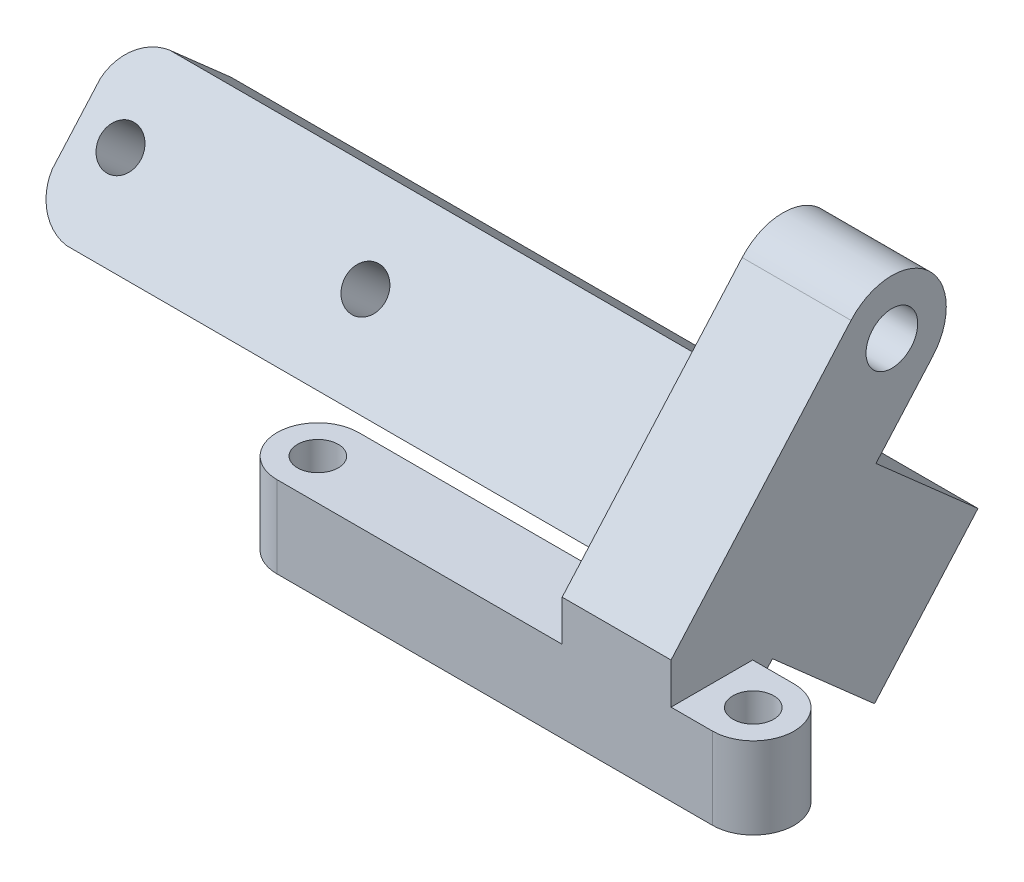
ISO-10303-21;
HEADER;
FILE_DESCRIPTION(('STEP AP214'),'2;1');
FILE_NAME('part.step','',(''),(''),'','','');
FILE_SCHEMA(('AUTOMOTIVE_DESIGN { 1 0 10303 214 1 1 1 1 }'));
ENDSEC;
DATA;
#1=APPLICATION_CONTEXT('core data for automotive mechanical design processes');
#2=APPLICATION_PROTOCOL_DEFINITION('international standard','automotive_design',2000,#1);
#3=PRODUCT_CONTEXT('',#1,'mechanical');
#4=PRODUCT('Part','Part','',(#3));
#5=PRODUCT_RELATED_PRODUCT_CATEGORY('part','',(#4));
#6=PRODUCT_DEFINITION_FORMATION('','',#4);
#7=PRODUCT_DEFINITION_CONTEXT('part definition',#1,'design');
#8=PRODUCT_DEFINITION('design','',#6,#7);
#9=PRODUCT_DEFINITION_SHAPE('','',#8);
#10=(LENGTH_UNIT() NAMED_UNIT(*) SI_UNIT(.MILLI.,.METRE.));
#11=(NAMED_UNIT(*) PLANE_ANGLE_UNIT() SI_UNIT($,.RADIAN.));
#12=(NAMED_UNIT(*) SI_UNIT($,.STERADIAN.) SOLID_ANGLE_UNIT());
#13=UNCERTAINTY_MEASURE_WITH_UNIT(LENGTH_MEASURE(1.E-05),#10,'distance_accuracy_value','');
#14=(GEOMETRIC_REPRESENTATION_CONTEXT(3) GLOBAL_UNCERTAINTY_ASSIGNED_CONTEXT((#13)) GLOBAL_UNIT_ASSIGNED_CONTEXT((#10,
#11,#12)) REPRESENTATION_CONTEXT('',''));
#15=CARTESIAN_POINT('',(0.,0.,0.));
#16=DIRECTION('',(0.,0.,1.));
#17=DIRECTION('',(1.,0.,0.));
#18=AXIS2_PLACEMENT_3D('',#15,#16,#17);
#19=CARTESIAN_POINT('',(-9.72275825615475,1.36573868678583,-19.5587169959805));
#20=DIRECTION('',(0.,-0.749999999999999,0.661437827766149));
#21=DIRECTION('',(0.,-0.661437827766149,-0.749999999999999));
#22=AXIS2_PLACEMENT_3D('',#19,#20,#21);
#23=PLANE('',#22);
#24=DIRECTION('',(0.,-0.661437827766149,-0.749999999999999));
#25=VECTOR('',#24,1.);
#26=CARTESIAN_POINT('',(-64.6035882970213,7.98011696444732,-12.0587169959806));
#27=LINE('',#26,#25);
#28=CARTESIAN_POINT('',(-64.6035882970213,5.33436565338272,-15.0587169959806));
#29=VERTEX_POINT('',#28);
#30=CARTESIAN_POINT('',(-64.6035882970213,1.36573868678583,-19.5587169959805));
#31=VERTEX_POINT('',#30);
#32=EDGE_CURVE('E185',#29,#31,#27,.T.);
#33=ORIENTED_EDGE('',*,*,#32,.F.);
#34=DIRECTION('',(1.,0.,0.));
#35=VECTOR('',#34,1.);
#36=CARTESIAN_POINT('',(-67.683307842008,5.33436565338272,-15.0587169959806));
#37=LINE('',#36,#35);
#38=CARTESIAN_POINT('',(-17.683307842008,5.33436565338272,-15.0587169959806));
#39=VERTEX_POINT('',#38);
#40=EDGE_CURVE('E299',#29,#39,#37,.T.);
#41=ORIENTED_EDGE('',*,*,#40,.T.);
#42=DIRECTION('',(0.,0.661437827766149,0.749999999999999));
#43=VECTOR('',#42,1.);
#44=CARTESIAN_POINT('',(-17.683307842008,1.36573868678583,-19.5587169959805));
#45=LINE('',#44,#43);
#46=CARTESIAN_POINT('',(-17.683307842008,7.98011696444732,-12.0587169959806));
#47=VERTEX_POINT('',#46);
#48=EDGE_CURVE('E201',#39,#47,#45,.T.);
#49=ORIENTED_EDGE('',*,*,#48,.T.);
#50=DIRECTION('',(1.,0.,0.));
#51=VECTOR('',#50,1.);
#52=CARTESIAN_POINT('',(-9.72275825615475,7.98011696444732,-12.0587169959806));
#53=LINE('',#52,#51);
#54=CARTESIAN_POINT('',(-9.72275825615475,7.98011696444732,-12.0587169959806));
#55=VERTEX_POINT('',#54);
#56=EDGE_CURVE('E209',#47,#55,#53,.T.);
#57=ORIENTED_EDGE('',*,*,#56,.T.);
#58=DIRECTION('',(0.,0.661437827766149,0.749999999999999));
#59=VECTOR('',#58,1.);
#60=CARTESIAN_POINT('',(-9.72275825615475,1.36573868678583,-19.5587169959805));
#61=LINE('',#60,#59);
#62=CARTESIAN_POINT('',(-9.72275825615475,1.36573868678583,-19.5587169959805));
#63=VERTEX_POINT('',#62);
#64=EDGE_CURVE('E221',#63,#55,#61,.T.);
#65=ORIENTED_EDGE('',*,*,#64,.F.);
#66=DIRECTION('',(1.,0.,0.));
#67=VECTOR('',#66,1.);
#68=CARTESIAN_POINT('',(-9.72275825615475,1.36573868678583,-19.5587169959805));
#69=LINE('',#68,#67);
#70=EDGE_CURVE('E205',#31,#63,#69,.T.);
#71=ORIENTED_EDGE('',*,*,#70,.F.);
#72=EDGE_LOOP('',(#33,#41,#49,#57,#65,#71));
#73=FACE_BOUND('',#72,.T.);
#74=ADVANCED_FACE('F53',(#73),#23,.F.);
#75=CARTESIAN_POINT('',(0.,-9.10514578731686,-10.3242648875262));
#76=DIRECTION('',(0.,0.661437827766149,0.749999999999999));
#77=DIRECTION('',(0.,-0.749999999999999,0.661437827766149));
#78=AXIS2_PLACEMENT_3D('',#75,#76,#77);
#79=PLANE('',#78);
#80=CARTESIAN_POINT('',(-46.4806243326334,-2.89663828630192,-15.7996538410477));
#81=DIRECTION('',(0.,-0.661437827766149,-0.749999999999999));
#82=DIRECTION('',(0.,0.749999999999999,-0.661437827766149));
#83=AXIS2_PLACEMENT_3D('',#80,#81,#82);
#84=CIRCLE('',#83,1.5);
#85=CARTESIAN_POINT('',(-46.4806243326334,-1.77163828630192,-16.7918105826969));
#86=VERTEX_POINT('',#85);
#87=EDGE_CURVE('E195',#86,#86,#84,.T.);
#88=ORIENTED_EDGE('',*,*,#87,.F.);
#89=EDGE_LOOP('',(#88));
#90=FACE_BOUND('',#89,.T.);
#91=CARTESIAN_POINT('',(-64.4806243326334,-2.89663828630192,-15.7996538410477));
#92=DIRECTION('',(0.,-0.661437827766149,-0.749999999999999));
#93=DIRECTION('',(0.,0.749999999999999,-0.661437827766149));
#94=AXIS2_PLACEMENT_3D('',#91,#92,#93);
#95=CIRCLE('',#94,1.50000000000001);
#96=CARTESIAN_POINT('',(-64.4806243326334,-1.77163828630191,-16.791810582697));
#97=VERTEX_POINT('',#96);
#98=EDGE_CURVE('E682',#97,#97,#95,.T.);
#99=ORIENTED_EDGE('',*,*,#98,.F.);
#100=EDGE_LOOP('',(#99));
#101=FACE_BOUND('',#100,.T.);
#102=CARTESIAN_POINT('',(-64.2234998938822,-1.22911727430847,-17.2702691422842));
#103=DIRECTION('',(0.,-0.661437827766149,-0.749999999999999));
#104=DIRECTION('',(0.,0.749999999999999,-0.661437827766149));
#105=AXIS2_PLACEMENT_3D('',#102,#103,#104);
#106=CIRCLE('',#105,3.48062325340086);
#107=CARTESIAN_POINT('',(-67.683307842008,-0.944050971954209,-17.5216739900156));
#108=VERTEX_POINT('',#107);
#109=EDGE_CURVE('E69',#108,#31,#106,.T.);
#110=ORIENTED_EDGE('',*,*,#109,.T.);
#111=ORIENTED_EDGE('',*,*,#70,.T.);
#112=DIRECTION('',(0.,-0.749999999999999,0.661437827766149));
#113=VECTOR('',#112,1.);
#114=CARTESIAN_POINT('',(-9.72275825615475,1.36573868678583,-19.5587169959805));
#115=LINE('',#114,#113);
#116=CARTESIAN_POINT('',(-9.72275825615475,-7.25926131321417,-11.9521819766698));
#117=VERTEX_POINT('',#116);
#118=EDGE_CURVE('E199',#63,#117,#115,.T.);
#119=ORIENTED_EDGE('',*,*,#118,.T.);
#120=DIRECTION('',(-1.,0.,0.));
#121=VECTOR('',#120,1.);
#122=CARTESIAN_POINT('',(-9.72275825615475,-7.25926131321417,-11.9521819766698));
#123=LINE('',#122,#121);
#124=CARTESIAN_POINT('',(-64.6035882970212,-7.25926131321416,-11.9521819766698));
#125=VERTEX_POINT('',#124);
#126=EDGE_CURVE('E192',#117,#125,#123,.T.);
#127=ORIENTED_EDGE('',*,*,#126,.T.);
#128=CARTESIAN_POINT('',(-64.2234998938822,-4.66440535211986,-14.2406298303662));
#129=DIRECTION('',(0.,-0.661437827766149,-0.749999999999999));
#130=DIRECTION('',(0.,0.749999999999999,-0.661437827766149));
#131=AXIS2_PLACEMENT_3D('',#128,#129,#130);
#132=CIRCLE('',#131,3.48062325340086);
#133=CARTESIAN_POINT('',(-67.683307842008,-4.94947165447413,-13.9892249826348));
#134=VERTEX_POINT('',#133);
#135=EDGE_CURVE('E177',#134,#125,#132,.F.);
#136=ORIENTED_EDGE('',*,*,#135,.F.);
#137=DIRECTION('',(0.,-0.749999999999999,0.661437827766149));
#138=VECTOR('',#137,1.);
#139=CARTESIAN_POINT('',(-67.683307842008,1.36573868678583,-19.5587169959805));
#140=LINE('',#139,#138);
#141=EDGE_CURVE('E295',#108,#134,#140,.T.);
#142=ORIENTED_EDGE('',*,*,#141,.F.);
#143=EDGE_LOOP('',(#110,#111,#119,#127,#136,#142));
#144=FACE_BOUND('',#143,.T.);
#145=ADVANCED_FACE('F197',(#90,#101,#144),#79,.F.);
#146=CARTESIAN_POINT('',(-67.683307842008,5.33436565338272,-15.0587169959806));
#147=DIRECTION('',(0.,0.661437827766149,0.749999999999998));
#148=DIRECTION('',(0.,-0.749999999999999,0.661437827766149));
#149=AXIS2_PLACEMENT_3D('',#146,#147,#148);
#150=PLANE('',#149);
#151=CARTESIAN_POINT('',(-46.4806243326334,1.07198868029497,-11.2996538410477));
#152=DIRECTION('',(0.,0.661437827766149,0.749999999999998));
#153=DIRECTION('',(0.,-0.749999999999999,0.661437827766149));
#154=AXIS2_PLACEMENT_3D('',#151,#152,#153);
#155=CIRCLE('',#154,1.5);
#156=CARTESIAN_POINT('',(-46.4806243326334,-0.0530113197050287,-10.3074970993985));
#157=VERTEX_POINT('',#156);
#158=EDGE_CURVE('E282',#157,#157,#155,.T.);
#159=ORIENTED_EDGE('',*,*,#158,.F.);
#160=EDGE_LOOP('',(#159));
#161=FACE_BOUND('',#160,.T.);
#162=CARTESIAN_POINT('',(-64.4806243326334,1.07198868029498,-11.2996538410477));
#163=DIRECTION('',(0.,0.661437827766149,0.749999999999998));
#164=DIRECTION('',(0.,-0.749999999999999,0.661437827766149));
#165=AXIS2_PLACEMENT_3D('',#162,#163,#164);
#166=CIRCLE('',#165,1.50000000000001);
#167=CARTESIAN_POINT('',(-64.4806243326334,2.19698868029498,-12.291810582697));
#168=VERTEX_POINT('',#167);
#169=EDGE_CURVE('E280',#168,#168,#166,.T.);
#170=ORIENTED_EDGE('',*,*,#169,.F.);
#171=EDGE_LOOP('',(#170));
#172=FACE_BOUND('',#171,.T.);
#173=ORIENTED_EDGE('',*,*,#40,.F.);
#174=CARTESIAN_POINT('',(-64.2234998938822,2.73950969228842,-12.7702691422842));
#175=DIRECTION('',(0.,0.661437827766149,0.749999999999998));
#176=DIRECTION('',(0.,-0.749999999999999,0.661437827766149));
#177=AXIS2_PLACEMENT_3D('',#174,#175,#176);
#178=CIRCLE('',#177,3.48062325340086);
#179=CARTESIAN_POINT('',(-67.683307842008,3.02457599464269,-13.0216739900156));
#180=VERTEX_POINT('',#179);
#181=EDGE_CURVE('E283',#29,#180,#178,.T.);
#182=ORIENTED_EDGE('',*,*,#181,.T.);
#183=DIRECTION('',(0.,-0.749999999999999,0.661437827766149));
#184=VECTOR('',#183,1.);
#185=CARTESIAN_POINT('',(-67.683307842008,5.33436565338272,-15.0587169959806));
#186=LINE('',#185,#184);
#187=CARTESIAN_POINT('',(-67.683307842008,-0.980844687877245,-9.48922498263479));
#188=VERTEX_POINT('',#187);
#189=EDGE_CURVE('E289',#180,#188,#186,.T.);
#190=ORIENTED_EDGE('',*,*,#189,.T.);
#191=CARTESIAN_POINT('',(-64.2234998938822,-0.69577838552297,-9.74062983036618));
#192=DIRECTION('',(0.,0.661437827766149,0.749999999999998));
#193=DIRECTION('',(0.,-0.749999999999999,0.661437827766149));
#194=AXIS2_PLACEMENT_3D('',#191,#192,#193);
#195=CIRCLE('',#194,3.48062325340086);
#196=CARTESIAN_POINT('',(-64.6035882970212,-3.29063434661727,-7.45218197666983));
#197=VERTEX_POINT('',#196);
#198=EDGE_CURVE('E77',#197,#188,#195,.F.);
#199=ORIENTED_EDGE('',*,*,#198,.F.);
#200=DIRECTION('',(1.,0.,0.));
#201=VECTOR('',#200,1.);
#202=CARTESIAN_POINT('',(-67.683307842008,-3.29063434661728,-7.45218197666982));
#203=LINE('',#202,#201);
#204=CARTESIAN_POINT('',(-17.683307842008,-3.29063434661728,-7.45218197666982));
#205=VERTEX_POINT('',#204);
#206=EDGE_CURVE('E194',#197,#205,#203,.T.);
#207=ORIENTED_EDGE('',*,*,#206,.T.);
#208=DIRECTION('',(0.,-0.749999999999999,0.661437827766149));
#209=VECTOR('',#208,1.);
#210=CARTESIAN_POINT('',(-17.683307842008,5.33436565338272,-15.0587169959806));
#211=LINE('',#210,#209);
#212=EDGE_CURVE('E285',#39,#205,#211,.T.);
#213=ORIENTED_EDGE('',*,*,#212,.F.);
#214=EDGE_LOOP('',(#173,#182,#190,#199,#207,#213));
#215=FACE_BOUND('',#214,.T.);
#216=ADVANCED_FACE('F411',(#161,#172,#215),#150,.T.);
#217=CARTESIAN_POINT('',(-67.683307842008,0.,0.));
#218=DIRECTION('',(1.,0.,0.));
#219=DIRECTION('',(0.,0.,-1.));
#220=AXIS2_PLACEMENT_3D('',#217,#218,#219);
#221=PLANE('',#220);
#222=DIRECTION('',(0.,-0.661437827766149,-0.749999999999999));
#223=VECTOR('',#222,1.);
#224=CARTESIAN_POINT('',(-67.683307842008,5.67032730570729,-10.0216739900156));
#225=LINE('',#224,#223);
#226=EDGE_CURVE('E12',#108,#180,#225,.F.);
#227=ORIENTED_EDGE('',*,*,#226,.F.);
#228=ORIENTED_EDGE('',*,*,#141,.T.);
#229=DIRECTION('',(0.,-0.661437827766149,-0.749999999999999));
#230=VECTOR('',#229,1.);
#231=CARTESIAN_POINT('',(-67.683307842008,1.66490662318736,-6.48922498263479));
#232=LINE('',#231,#230);
#233=EDGE_CURVE('E62',#134,#188,#232,.F.);
#234=ORIENTED_EDGE('',*,*,#233,.T.);
#235=ORIENTED_EDGE('',*,*,#189,.F.);
#236=EDGE_LOOP('',(#227,#228,#234,#235));
#237=FACE_BOUND('',#236,.T.);
#238=ADVANCED_FACE('F428',(#237),#221,.F.);
#239=CARTESIAN_POINT('',(-17.7227582561547,12.7084973778708,-16.228756555323));
#240=DIRECTION('',(0.,0.661437827766149,0.749999999999999));
#241=DIRECTION('',(0.,-0.749999999999999,0.661437827766149));
#242=AXIS2_PLACEMENT_3D('',#239,#240,#241);
#243=PLANE('',#242);
#244=ORIENTED_EDGE('',*,*,#56,.F.);
#245=DIRECTION('',(0.,0.749999999999999,-0.661437827766149));
#246=VECTOR('',#245,1.);
#247=CARTESIAN_POINT('',(-17.683307842008,7.98011696444732,-12.0587169959806));
#248=LINE('',#247,#246);
#249=CARTESIAN_POINT('',(-17.683307842008,-0.644883035552683,-4.45218197666983));
#250=VERTEX_POINT('',#249);
#251=EDGE_CURVE('E215',#250,#47,#248,.T.);
#252=ORIENTED_EDGE('',*,*,#251,.F.);
#253=DIRECTION('',(-1.,0.,0.));
#254=VECTOR('',#253,1.);
#255=CARTESIAN_POINT('',(-9.72275825615475,-0.644883035552682,-4.45218197666983));
#256=LINE('',#255,#254);
#257=CARTESIAN_POINT('',(-9.72275825615475,-0.644883035552685,-4.45218197666982));
#258=VERTEX_POINT('',#257);
#259=EDGE_CURVE('E212',#258,#250,#256,.T.);
#260=ORIENTED_EDGE('',*,*,#259,.F.);
#261=DIRECTION('',(0.,-0.749999999999999,0.661437827766149));
#262=VECTOR('',#261,1.);
#263=CARTESIAN_POINT('',(-9.72275825615475,12.7084973778708,-16.228756555323));
#264=LINE('',#263,#262);
#265=CARTESIAN_POINT('',(-9.72275825615475,-2.29150262212921,-3.));
#266=VERTEX_POINT('',#265);
#267=EDGE_CURVE('E224',#258,#266,#264,.T.);
#268=ORIENTED_EDGE('',*,*,#267,.T.);
#269=DIRECTION('',(1.,0.,0.));
#270=VECTOR('',#269,1.);
#271=CARTESIAN_POINT('',(-17.7227582561547,-2.2915026221292,-3.));
#272=LINE('',#271,#270);
#273=CARTESIAN_POINT('',(-17.7227582561547,-2.29150262212921,-3.));
#274=VERTEX_POINT('',#273);
#275=EDGE_CURVE('E232',#274,#266,#272,.T.);
#276=ORIENTED_EDGE('',*,*,#275,.F.);
#277=DIRECTION('',(0.,-0.749999999999999,0.661437827766149));
#278=VECTOR('',#277,1.);
#279=CARTESIAN_POINT('',(-17.7227582561547,12.7084973778708,-16.228756555323));
#280=LINE('',#279,#278);
#281=CARTESIAN_POINT('',(-17.7227582561547,12.7084973778708,-16.228756555323));
#282=VERTEX_POINT('',#281);
#283=EDGE_CURVE('E237',#282,#274,#280,.T.);
#284=ORIENTED_EDGE('',*,*,#283,.F.);
#285=DIRECTION('',(1.,0.,0.));
#286=VECTOR('',#285,1.);
#287=CARTESIAN_POINT('',(-17.7227582561547,12.7084973778708,-16.228756555323));
#288=LINE('',#287,#286);
#289=CARTESIAN_POINT('',(-9.72275825615475,12.7084973778708,-16.228756555323));
#290=VERTEX_POINT('',#289);
#291=EDGE_CURVE('E228',#282,#290,#288,.T.);
#292=ORIENTED_EDGE('',*,*,#291,.T.);
#293=EDGE_CURVE('E244',#290,#55,#264,.T.);
#294=ORIENTED_EDGE('',*,*,#293,.T.);
#295=EDGE_LOOP('',(#244,#252,#260,#268,#276,#284,#292,#294));
#296=FACE_BOUND('',#295,.T.);
#297=ADVANCED_FACE('F313',(#296),#243,.F.);
#298=CARTESIAN_POINT('',(0.,-6.,-3.));
#299=DIRECTION('',(0.,0.,1.));
#300=DIRECTION('',(1.,0.,0.));
#301=AXIS2_PLACEMENT_3D('',#298,#299,#300);
#302=PLANE('',#301);
#303=DIRECTION('',(0.,1.,0.));
#304=VECTOR('',#303,1.);
#305=CARTESIAN_POINT('',(-17.7227582561547,-6.,-3.));
#306=LINE('',#305,#304);
#307=CARTESIAN_POINT('',(-17.7227582561547,0.,-3.));
#308=VERTEX_POINT('',#307);
#309=EDGE_CURVE('E253',#274,#308,#306,.T.);
#310=ORIENTED_EDGE('',*,*,#309,.F.);
#311=ORIENTED_EDGE('',*,*,#275,.T.);
#312=DIRECTION('',(0.,1.,0.));
#313=VECTOR('',#312,1.);
#314=CARTESIAN_POINT('',(-9.72275825615475,-6.,-3.));
#315=LINE('',#314,#313);
#316=CARTESIAN_POINT('',(-9.72275825615475,0.,-3.));
#317=VERTEX_POINT('',#316);
#318=EDGE_CURVE('E235',#266,#317,#315,.T.);
#319=ORIENTED_EDGE('',*,*,#318,.T.);
#320=DIRECTION('',(1.,0.,0.));
#321=VECTOR('',#320,1.);
#322=CARTESIAN_POINT('',(0.,0.,-3.));
#323=LINE('',#322,#321);
#324=CARTESIAN_POINT('',(-6.67696888733747,0.,-3.));
#325=VERTEX_POINT('',#324);
#326=EDGE_CURVE('E321',#317,#325,#323,.T.);
#327=ORIENTED_EDGE('',*,*,#326,.T.);
#328=DIRECTION('',(0.,1.,0.));
#329=VECTOR('',#328,1.);
#330=CARTESIAN_POINT('',(-6.67696888733747,-6.,-3.));
#331=LINE('',#330,#329);
#332=CARTESIAN_POINT('',(-6.67696888733747,-6.,-3.));
#333=VERTEX_POINT('',#332);
#334=EDGE_CURVE('E355',#333,#325,#331,.T.);
#335=ORIENTED_EDGE('',*,*,#334,.F.);
#336=DIRECTION('',(1.,0.,0.));
#337=VECTOR('',#336,1.);
#338=CARTESIAN_POINT('',(0.,-6.,-3.));
#339=LINE('',#338,#337);
#340=CARTESIAN_POINT('',(-38.6769688873375,-6.,-3.));
#341=VERTEX_POINT('',#340);
#342=EDGE_CURVE('E374',#341,#333,#339,.T.);
#343=ORIENTED_EDGE('',*,*,#342,.F.);
#344=DIRECTION('',(0.,1.,0.));
#345=VECTOR('',#344,1.);
#346=CARTESIAN_POINT('',(-38.6769688873375,-6.,-3.));
#347=LINE('',#346,#345);
#348=CARTESIAN_POINT('',(-38.6769688873375,0.,-3.));
#349=VERTEX_POINT('',#348);
#350=EDGE_CURVE('E353',#341,#349,#347,.T.);
#351=ORIENTED_EDGE('',*,*,#350,.T.);
#352=EDGE_CURVE('E329',#349,#308,#323,.T.);
#353=ORIENTED_EDGE('',*,*,#352,.T.);
#354=EDGE_LOOP('',(#310,#311,#319,#327,#335,#343,#351,#353));
#355=FACE_BOUND('',#354,.T.);
#356=ADVANCED_FACE('F319',(#355),#302,.F.);
#357=CARTESIAN_POINT('',(0.,0.,0.));
#358=DIRECTION('',(0.,1.,0.));
#359=DIRECTION('',(0.,0.,1.));
#360=AXIS2_PLACEMENT_3D('',#357,#358,#359);
#361=PLANE('',#360);
#362=CARTESIAN_POINT('',(-6.67696888733747,0.,0.));
#363=DIRECTION('',(0.,1.,0.));
#364=DIRECTION('',(0.,0.,1.));
#365=AXIS2_PLACEMENT_3D('',#362,#363,#364);
#366=CIRCLE('',#365,1.5);
#367=CARTESIAN_POINT('',(-6.67696888733747,0.,1.5));
#368=VERTEX_POINT('',#367);
#369=EDGE_CURVE('E348',#368,#368,#366,.T.);
#370=ORIENTED_EDGE('',*,*,#369,.F.);
#371=EDGE_LOOP('',(#370));
#372=FACE_BOUND('',#371,.T.);
#373=ORIENTED_EDGE('',*,*,#326,.F.);
#374=DIRECTION('',(0.,0.,1.));
#375=VECTOR('',#374,1.);
#376=CARTESIAN_POINT('',(-9.72275825615475,0.,0.));
#377=LINE('',#376,#375);
#378=CARTESIAN_POINT('',(-9.72275825615475,0.,3.));
#379=VERTEX_POINT('',#378);
#380=EDGE_CURVE('E258',#317,#379,#377,.T.);
#381=ORIENTED_EDGE('',*,*,#380,.T.);
#382=DIRECTION('',(1.,0.,0.));
#383=VECTOR('',#382,1.);
#384=CARTESIAN_POINT('',(0.,0.,3.));
#385=LINE('',#384,#383);
#386=CARTESIAN_POINT('',(-6.67696888733747,0.,3.));
#387=VERTEX_POINT('',#386);
#388=EDGE_CURVE('E362',#379,#387,#385,.T.);
#389=ORIENTED_EDGE('',*,*,#388,.T.);
#390=CARTESIAN_POINT('',(-6.67696888733747,0.,0.));
#391=DIRECTION('',(0.,1.,0.));
#392=DIRECTION('',(0.,0.,1.));
#393=AXIS2_PLACEMENT_3D('',#390,#391,#392);
#394=CIRCLE('',#393,3.);
#395=EDGE_CURVE('E328',#387,#325,#394,.T.);
#396=ORIENTED_EDGE('',*,*,#395,.T.);
#397=EDGE_LOOP('',(#373,#381,#389,#396));
#398=FACE_BOUND('',#397,.T.);
#399=ADVANCED_FACE('F325',(#372,#398),#361,.T.);
#400=CARTESIAN_POINT('',(0.,-6.,3.));
#401=DIRECTION('',(0.,0.,1.));
#402=DIRECTION('',(1.,0.,0.));
#403=AXIS2_PLACEMENT_3D('',#400,#401,#402);
#404=PLANE('',#403);
#405=CARTESIAN_POINT('',(-38.6769688873375,0.,3.));
#406=VERTEX_POINT('',#405);
#407=CARTESIAN_POINT('',(-17.7227582561547,0.,3.));
#408=VERTEX_POINT('',#407);
#409=EDGE_CURVE('E334',#406,#408,#385,.T.);
#410=ORIENTED_EDGE('',*,*,#409,.F.);
#411=DIRECTION('',(0.,1.,0.));
#412=VECTOR('',#411,1.);
#413=CARTESIAN_POINT('',(-38.6769688873375,-6.,3.));
#414=LINE('',#413,#412);
#415=CARTESIAN_POINT('',(-38.6769688873375,-6.,3.));
#416=VERTEX_POINT('',#415);
#417=EDGE_CURVE('E278',#416,#406,#414,.T.);
#418=ORIENTED_EDGE('',*,*,#417,.F.);
#419=DIRECTION('',(1.,0.,0.));
#420=VECTOR('',#419,1.);
#421=CARTESIAN_POINT('',(0.,-6.,3.));
#422=LINE('',#421,#420);
#423=CARTESIAN_POINT('',(-6.67696888733747,-6.,3.));
#424=VERTEX_POINT('',#423);
#425=EDGE_CURVE('E351',#416,#424,#422,.T.);
#426=ORIENTED_EDGE('',*,*,#425,.T.);
#427=DIRECTION('',(0.,1.,0.));
#428=VECTOR('',#427,1.);
#429=CARTESIAN_POINT('',(-6.67696888733747,-6.,3.));
#430=LINE('',#429,#428);
#431=EDGE_CURVE('E357',#424,#387,#430,.T.);
#432=ORIENTED_EDGE('',*,*,#431,.T.);
#433=ORIENTED_EDGE('',*,*,#388,.F.);
#434=DIRECTION('',(0.,-1.,0.));
#435=VECTOR('',#434,1.);
#436=CARTESIAN_POINT('',(-9.72275825615475,3.,3.));
#437=LINE('',#436,#435);
#438=CARTESIAN_POINT('',(-9.72275825615475,3.,3.));
#439=VERTEX_POINT('',#438);
#440=EDGE_CURVE('E262',#439,#379,#437,.T.);
#441=ORIENTED_EDGE('',*,*,#440,.F.);
#442=DIRECTION('',(1.,0.,0.));
#443=VECTOR('',#442,1.);
#444=CARTESIAN_POINT('',(0.,3.,3.));
#445=LINE('',#444,#443);
#446=CARTESIAN_POINT('',(-17.7227582561547,3.,3.));
#447=VERTEX_POINT('',#446);
#448=EDGE_CURVE('E259',#447,#439,#445,.T.);
#449=ORIENTED_EDGE('',*,*,#448,.F.);
#450=DIRECTION('',(0.,-1.,0.));
#451=VECTOR('',#450,1.);
#452=CARTESIAN_POINT('',(-17.7227582561547,3.,3.));
#453=LINE('',#452,#451);
#454=EDGE_CURVE('E275',#447,#408,#453,.T.);
#455=ORIENTED_EDGE('',*,*,#454,.T.);
#456=EDGE_LOOP('',(#410,#418,#426,#432,#433,#441,#449,#455));
#457=FACE_BOUND('',#456,.T.);
#458=ADVANCED_FACE('F55',(#457),#404,.T.);
#459=CARTESIAN_POINT('',(-38.6769688873375,-6.,0.));
#460=DIRECTION('',(0.,1.,0.));
#461=DIRECTION('',(0.,0.,1.));
#462=AXIS2_PLACEMENT_3D('',#459,#460,#461);
#463=CYLINDRICAL_SURFACE('',#462,3.);
#464=CARTESIAN_POINT('',(-38.6769688873375,0.,0.));
#465=DIRECTION('',(0.,1.,0.));
#466=DIRECTION('',(0.,0.,1.));
#467=AXIS2_PLACEMENT_3D('',#464,#465,#466);
#468=CIRCLE('',#467,3.);
#469=EDGE_CURVE('E332',#349,#406,#468,.T.);
#470=ORIENTED_EDGE('',*,*,#469,.F.);
#471=ORIENTED_EDGE('',*,*,#350,.F.);
#472=CARTESIAN_POINT('',(-38.6769688873375,-6.,0.));
#473=DIRECTION('',(0.,1.,0.));
#474=DIRECTION('',(0.,0.,1.));
#475=AXIS2_PLACEMENT_3D('',#472,#473,#474);
#476=CIRCLE('',#475,3.);
#477=EDGE_CURVE('E371',#341,#416,#476,.T.);
#478=ORIENTED_EDGE('',*,*,#477,.T.);
#479=ORIENTED_EDGE('',*,*,#417,.T.);
#480=EDGE_LOOP('',(#470,#471,#478,#479));
#481=FACE_BOUND('',#480,.T.);
#482=ADVANCED_FACE('F389',(#481),#463,.T.);
#483=CARTESIAN_POINT('',(-38.6769688873375,-6.,0.));
#484=DIRECTION('',(0.,1.,0.));
#485=DIRECTION('',(0.,0.,1.));
#486=AXIS2_PLACEMENT_3D('',#483,#484,#485);
#487=CYLINDRICAL_SURFACE('',#486,1.5);
#488=CARTESIAN_POINT('',(-38.6769688873375,-6.,0.));
#489=DIRECTION('',(0.,1.,0.));
#490=DIRECTION('',(0.,0.,1.));
#491=AXIS2_PLACEMENT_3D('',#488,#489,#490);
#492=CIRCLE('',#491,1.5);
#493=CARTESIAN_POINT('',(-38.6769688873375,-6.,1.5));
#494=VERTEX_POINT('',#493);
#495=EDGE_CURVE('E368',#494,#494,#492,.T.);
#496=ORIENTED_EDGE('',*,*,#495,.F.);
#497=EDGE_LOOP('',(#496));
#498=FACE_BOUND('',#497,.T.);
#499=CARTESIAN_POINT('',(-38.6769688873375,0.,0.));
#500=DIRECTION('',(0.,1.,0.));
#501=DIRECTION('',(0.,0.,1.));
#502=AXIS2_PLACEMENT_3D('',#499,#500,#501);
#503=CIRCLE('',#502,1.5);
#504=CARTESIAN_POINT('',(-38.6769688873375,0.,1.5));
#505=VERTEX_POINT('',#504);
#506=EDGE_CURVE('E345',#505,#505,#503,.T.);
#507=ORIENTED_EDGE('',*,*,#506,.T.);
#508=EDGE_LOOP('',(#507));
#509=FACE_BOUND('',#508,.T.);
#510=ADVANCED_FACE('F396',(#498,#509),#487,.F.);
#511=CARTESIAN_POINT('',(-6.67696888733747,-6.,0.));
#512=DIRECTION('',(0.,1.,0.));
#513=DIRECTION('',(0.,0.,1.));
#514=AXIS2_PLACEMENT_3D('',#511,#512,#513);
#515=CYLINDRICAL_SURFACE('',#514,3.);
#516=ORIENTED_EDGE('',*,*,#395,.F.);
#517=ORIENTED_EDGE('',*,*,#431,.F.);
#518=CARTESIAN_POINT('',(-6.67696888733747,-6.,0.));
#519=DIRECTION('',(0.,1.,0.));
#520=DIRECTION('',(0.,0.,1.));
#521=AXIS2_PLACEMENT_3D('',#518,#519,#520);
#522=CIRCLE('',#521,3.);
#523=EDGE_CURVE('E376',#424,#333,#522,.T.);
#524=ORIENTED_EDGE('',*,*,#523,.T.);
#525=ORIENTED_EDGE('',*,*,#334,.T.);
#526=EDGE_LOOP('',(#516,#517,#524,#525));
#527=FACE_BOUND('',#526,.T.);
#528=ADVANCED_FACE('F393',(#527),#515,.T.);
#529=CARTESIAN_POINT('',(-6.67696888733747,-6.,0.));
#530=DIRECTION('',(0.,1.,0.));
#531=DIRECTION('',(0.,0.,1.));
#532=AXIS2_PLACEMENT_3D('',#529,#530,#531);
#533=CYLINDRICAL_SURFACE('',#532,1.5);
#534=CARTESIAN_POINT('',(-6.67696888733747,-6.,0.));
#535=DIRECTION('',(0.,1.,0.));
#536=DIRECTION('',(0.,0.,1.));
#537=AXIS2_PLACEMENT_3D('',#534,#535,#536);
#538=CIRCLE('',#537,1.5);
#539=CARTESIAN_POINT('',(-6.67696888733747,-6.,1.5));
#540=VERTEX_POINT('',#539);
#541=EDGE_CURVE('E360',#540,#540,#538,.T.);
#542=ORIENTED_EDGE('',*,*,#541,.F.);
#543=EDGE_LOOP('',(#542));
#544=FACE_BOUND('',#543,.T.);
#545=ORIENTED_EDGE('',*,*,#369,.T.);
#546=EDGE_LOOP('',(#545));
#547=FACE_BOUND('',#546,.T.);
#548=ADVANCED_FACE('F395',(#544,#547),#533,.F.);
#549=CARTESIAN_POINT('',(0.,-6.,0.));
#550=DIRECTION('',(0.,1.,0.));
#551=DIRECTION('',(0.,0.,1.));
#552=AXIS2_PLACEMENT_3D('',#549,#550,#551);
#553=PLANE('',#552);
#554=ORIENTED_EDGE('',*,*,#425,.F.);
#555=ORIENTED_EDGE('',*,*,#477,.F.);
#556=ORIENTED_EDGE('',*,*,#342,.T.);
#557=ORIENTED_EDGE('',*,*,#523,.F.);
#558=EDGE_LOOP('',(#554,#555,#556,#557));
#559=FACE_BOUND('',#558,.T.);
#560=ORIENTED_EDGE('',*,*,#495,.T.);
#561=EDGE_LOOP('',(#560));
#562=FACE_BOUND('',#561,.T.);
#563=ORIENTED_EDGE('',*,*,#541,.T.);
#564=EDGE_LOOP('',(#563));
#565=FACE_BOUND('',#564,.T.);
#566=ADVANCED_FACE('F385',(#559,#562,#565),#553,.F.);
#567=DIRECTION('',(0.,0.,1.));
#568=VECTOR('',#567,1.);
#569=CARTESIAN_POINT('',(-17.7227582561547,0.,0.));
#570=LINE('',#569,#568);
#571=EDGE_CURVE('E263',#308,#408,#570,.T.);
#572=ORIENTED_EDGE('',*,*,#571,.F.);
#573=ORIENTED_EDGE('',*,*,#352,.F.);
#574=ORIENTED_EDGE('',*,*,#469,.T.);
#575=ORIENTED_EDGE('',*,*,#409,.T.);
#576=EDGE_LOOP('',(#572,#573,#574,#575));
#577=FACE_BOUND('',#576,.T.);
#578=ORIENTED_EDGE('',*,*,#506,.F.);
#579=EDGE_LOOP('',(#578));
#580=FACE_BOUND('',#579,.T.);
#581=ADVANCED_FACE('F434',(#577,#580),#361,.T.);
#582=CARTESIAN_POINT('',(-9.72275825615475,3.,0.));
#583=DIRECTION('',(1.,0.,0.));
#584=DIRECTION('',(0.,0.,-1.));
#585=AXIS2_PLACEMENT_3D('',#582,#583,#584);
#586=PLANE('',#585);
#587=CARTESIAN_POINT('',(-9.72275825615475,15.3542486889354,-13.228756555323));
#588=DIRECTION('',(1.,0.,0.));
#589=DIRECTION('',(0.,0.,-1.));
#590=AXIS2_PLACEMENT_3D('',#587,#588,#589);
#591=CIRCLE('',#590,1.9);
#592=CARTESIAN_POINT('',(-9.72275825615475,15.3542486889354,-15.128756555323));
#593=VERTEX_POINT('',#592);
#594=EDGE_CURVE('E674',#593,#593,#591,.T.);
#595=ORIENTED_EDGE('',*,*,#594,.F.);
#596=EDGE_LOOP('',(#595));
#597=FACE_BOUND('',#596,.T.);
#598=ORIENTED_EDGE('',*,*,#380,.F.);
#599=ORIENTED_EDGE('',*,*,#318,.F.);
#600=ORIENTED_EDGE('',*,*,#267,.F.);
#601=DIRECTION('',(0.,0.661437827766149,0.749999999999999));
#602=VECTOR('',#601,1.);
#603=CARTESIAN_POINT('',(-9.72275825615475,-7.25926131321417,-11.9521819766698));
#604=LINE('',#603,#602);
#605=EDGE_CURVE('E219',#117,#258,#604,.T.);
#606=ORIENTED_EDGE('',*,*,#605,.F.);
#607=ORIENTED_EDGE('',*,*,#118,.F.);
#608=ORIENTED_EDGE('',*,*,#64,.T.);
#609=ORIENTED_EDGE('',*,*,#293,.F.);
#610=CARTESIAN_POINT('',(-9.72275825615475,15.3542486889354,-13.228756555323));
#611=DIRECTION('',(1.,0.,0.));
#612=DIRECTION('',(0.,0.,-1.));
#613=AXIS2_PLACEMENT_3D('',#610,#611,#612);
#614=CIRCLE('',#613,4.00000000000001);
#615=CARTESIAN_POINT('',(-9.72275825615475,18.,-10.228756555323));
#616=VERTEX_POINT('',#615);
#617=EDGE_CURVE('E229',#290,#616,#614,.T.);
#618=ORIENTED_EDGE('',*,*,#617,.T.);
#619=DIRECTION('',(0.,-0.749999999999999,0.661437827766149));
#620=VECTOR('',#619,1.);
#621=CARTESIAN_POINT('',(-9.72275825615475,18.,-10.228756555323));
#622=LINE('',#621,#620);
#623=EDGE_CURVE('E241',#616,#439,#622,.T.);
#624=ORIENTED_EDGE('',*,*,#623,.T.);
#625=ORIENTED_EDGE('',*,*,#440,.T.);
#626=EDGE_LOOP('',(#598,#599,#600,#606,#607,#608,#609,#618,#624,#625));
#627=FACE_BOUND('',#626,.T.);
#628=ADVANCED_FACE('F307',(#597,#627),#586,.T.);
#629=CARTESIAN_POINT('',(-17.7227582561547,3.,0.));
#630=DIRECTION('',(1.,0.,0.));
#631=DIRECTION('',(0.,0.,-1.));
#632=AXIS2_PLACEMENT_3D('',#629,#630,#631);
#633=PLANE('',#632);
#634=CARTESIAN_POINT('',(-17.7227582561547,15.3542486889354,-13.228756555323));
#635=DIRECTION('',(1.,0.,0.));
#636=DIRECTION('',(0.,0.,-1.));
#637=AXIS2_PLACEMENT_3D('',#634,#635,#636);
#638=CIRCLE('',#637,1.9);
#639=CARTESIAN_POINT('',(-17.7227582561547,15.3542486889354,-15.128756555323));
#640=VERTEX_POINT('',#639);
#641=EDGE_CURVE('E57',#640,#640,#638,.T.);
#642=ORIENTED_EDGE('',*,*,#641,.T.);
#643=EDGE_LOOP('',(#642));
#644=FACE_BOUND('',#643,.T.);
#645=ORIENTED_EDGE('',*,*,#309,.T.);
#646=ORIENTED_EDGE('',*,*,#571,.T.);
#647=ORIENTED_EDGE('',*,*,#454,.F.);
#648=DIRECTION('',(0.,-0.749999999999999,0.661437827766149));
#649=VECTOR('',#648,1.);
#650=CARTESIAN_POINT('',(-17.7227582561547,18.,-10.228756555323));
#651=LINE('',#650,#649);
#652=CARTESIAN_POINT('',(-17.7227582561547,18.,-10.228756555323));
#653=VERTEX_POINT('',#652);
#654=EDGE_CURVE('E240',#653,#447,#651,.T.);
#655=ORIENTED_EDGE('',*,*,#654,.F.);
#656=CARTESIAN_POINT('',(-17.7227582561547,15.3542486889354,-13.228756555323));
#657=DIRECTION('',(1.,0.,0.));
#658=DIRECTION('',(0.,0.,-1.));
#659=AXIS2_PLACEMENT_3D('',#656,#657,#658);
#660=CIRCLE('',#659,4.00000000000001);
#661=EDGE_CURVE('E225',#282,#653,#660,.T.);
#662=ORIENTED_EDGE('',*,*,#661,.F.);
#663=ORIENTED_EDGE('',*,*,#283,.T.);
#664=EDGE_LOOP('',(#645,#646,#647,#655,#662,#663));
#665=FACE_BOUND('',#664,.T.);
#666=ADVANCED_FACE('F421',(#644,#665),#633,.F.);
#667=CARTESIAN_POINT('',(-17.7227582561547,15.3542486889354,-13.228756555323));
#668=DIRECTION('',(1.,0.,0.));
#669=DIRECTION('',(0.,0.,-1.));
#670=AXIS2_PLACEMENT_3D('',#667,#668,#669);
#671=CYLINDRICAL_SURFACE('',#670,4.00000000000001);
#672=ORIENTED_EDGE('',*,*,#617,.F.);
#673=ORIENTED_EDGE('',*,*,#291,.F.);
#674=ORIENTED_EDGE('',*,*,#661,.T.);
#675=DIRECTION('',(1.,0.,0.));
#676=VECTOR('',#675,1.);
#677=CARTESIAN_POINT('',(-17.7227582561547,18.,-10.228756555323));
#678=LINE('',#677,#676);
#679=EDGE_CURVE('E233',#653,#616,#678,.T.);
#680=ORIENTED_EDGE('',*,*,#679,.T.);
#681=EDGE_LOOP('',(#672,#673,#674,#680));
#682=FACE_BOUND('',#681,.T.);
#683=ADVANCED_FACE('F417',(#682),#671,.T.);
#684=CARTESIAN_POINT('',(-17.7227582561547,18.,-10.228756555323));
#685=DIRECTION('',(0.,0.661437827766149,0.749999999999999));
#686=DIRECTION('',(0.,-0.749999999999999,0.661437827766149));
#687=AXIS2_PLACEMENT_3D('',#684,#685,#686);
#688=PLANE('',#687);
#689=ORIENTED_EDGE('',*,*,#623,.F.);
#690=ORIENTED_EDGE('',*,*,#679,.F.);
#691=ORIENTED_EDGE('',*,*,#654,.T.);
#692=ORIENTED_EDGE('',*,*,#448,.T.);
#693=EDGE_LOOP('',(#689,#690,#691,#692));
#694=FACE_BOUND('',#693,.T.);
#695=ADVANCED_FACE('F420',(#694),#688,.T.);
#696=CARTESIAN_POINT('',(-9.72275825615475,-7.25926131321417,-11.9521819766698));
#697=DIRECTION('',(0.,0.749999999999999,-0.661437827766149));
#698=DIRECTION('',(0.,0.661437827766149,0.749999999999999));
#699=AXIS2_PLACEMENT_3D('',#696,#697,#698);
#700=PLANE('',#699);
#701=ORIENTED_EDGE('',*,*,#206,.F.);
#702=DIRECTION('',(0.,-0.661437827766149,-0.749999999999999));
#703=VECTOR('',#702,1.);
#704=CARTESIAN_POINT('',(-64.6035882970212,-0.644883035552669,-4.45218197666982));
#705=LINE('',#704,#703);
#706=EDGE_CURVE('E180',#197,#125,#705,.T.);
#707=ORIENTED_EDGE('',*,*,#706,.T.);
#708=ORIENTED_EDGE('',*,*,#126,.F.);
#709=ORIENTED_EDGE('',*,*,#605,.T.);
#710=ORIENTED_EDGE('',*,*,#259,.T.);
#711=DIRECTION('',(0.,0.661437827766149,0.749999999999999));
#712=VECTOR('',#711,1.);
#713=CARTESIAN_POINT('',(-17.683307842008,-7.25926131321417,-11.9521819766698));
#714=LINE('',#713,#712);
#715=EDGE_CURVE('E203',#205,#250,#714,.T.);
#716=ORIENTED_EDGE('',*,*,#715,.F.);
#717=EDGE_LOOP('',(#701,#707,#708,#709,#710,#716));
#718=FACE_BOUND('',#717,.T.);
#719=ADVANCED_FACE('F190',(#718),#700,.F.);
#720=CARTESIAN_POINT('',(-17.683307842008,1.36573868678583,-19.5587169959805));
#721=DIRECTION('',(1.,0.,0.));
#722=DIRECTION('',(0.,0.,-1.));
#723=AXIS2_PLACEMENT_3D('',#720,#721,#722);
#724=PLANE('',#723);
#725=ORIENTED_EDGE('',*,*,#48,.F.);
#726=ORIENTED_EDGE('',*,*,#212,.T.);
#727=ORIENTED_EDGE('',*,*,#715,.T.);
#728=ORIENTED_EDGE('',*,*,#251,.T.);
#729=EDGE_LOOP('',(#725,#726,#727,#728));
#730=FACE_BOUND('',#729,.T.);
#731=ADVANCED_FACE('F314',(#730),#724,.F.);
#732=CARTESIAN_POINT('',(-64.2234998938822,1.94997292554163,-6.74062983036617));
#733=DIRECTION('',(0.,-0.661437827766149,-0.749999999999999));
#734=DIRECTION('',(0.,0.749999999999999,-0.661437827766149));
#735=AXIS2_PLACEMENT_3D('',#732,#733,#734);
#736=CYLINDRICAL_SURFACE('',#735,3.48062325340086);
#737=ORIENTED_EDGE('',*,*,#198,.T.);
#738=ORIENTED_EDGE('',*,*,#233,.F.);
#739=ORIENTED_EDGE('',*,*,#135,.T.);
#740=ORIENTED_EDGE('',*,*,#706,.F.);
#741=EDGE_LOOP('',(#737,#738,#739,#740));
#742=FACE_BOUND('',#741,.T.);
#743=ADVANCED_FACE('F179',(#742),#736,.T.);
#744=CARTESIAN_POINT('',(-64.2234998938822,5.38526100335302,-9.77026914228421));
#745=DIRECTION('',(0.,-0.661437827766149,-0.749999999999999));
#746=DIRECTION('',(0.,0.749999999999999,-0.661437827766149));
#747=AXIS2_PLACEMENT_3D('',#744,#745,#746);
#748=CYLINDRICAL_SURFACE('',#747,3.48062325340086);
#749=ORIENTED_EDGE('',*,*,#32,.T.);
#750=ORIENTED_EDGE('',*,*,#109,.F.);
#751=ORIENTED_EDGE('',*,*,#226,.T.);
#752=ORIENTED_EDGE('',*,*,#181,.F.);
#753=EDGE_LOOP('',(#749,#750,#751,#752));
#754=FACE_BOUND('',#753,.T.);
#755=ADVANCED_FACE('F601',(#754),#748,.T.);
#756=CARTESIAN_POINT('',(-64.4806243326334,3.71773999135958,-8.29965384104773));
#757=DIRECTION('',(0.,-0.661437827766149,-0.749999999999999));
#758=DIRECTION('',(0.,0.749999999999999,-0.661437827766149));
#759=AXIS2_PLACEMENT_3D('',#756,#757,#758);
#760=CYLINDRICAL_SURFACE('',#759,1.50000000000001);
#761=CARTESIAN_POINT('',(-64.4806243326334,2.19698868029498,-12.291810582697));
#762=CARTESIAN_POINT('',(-64.4806243326334,2.1556488160596,-12.338685582697));
#763=CARTESIAN_POINT('',(-64.4806243326334,2.11430895182421,-12.385560582697));
#764=CARTESIAN_POINT('',(-64.4806243326334,2.03162922335344,-12.479310582697));
#765=CARTESIAN_POINT('',(-64.4806243326334,1.99028935911806,-12.526185582697));
#766=CARTESIAN_POINT('',(-64.4806243326334,1.90760963064729,-12.619935582697));
#767=CARTESIAN_POINT('',(-64.4806243326334,1.86626976641191,-12.666810582697));
#768=CARTESIAN_POINT('',(-64.4806243326334,1.78359003794114,-12.760560582697));
#769=CARTESIAN_POINT('',(-64.4806243326334,1.74225017370575,-12.807435582697));
#770=CARTESIAN_POINT('',(-64.4806243326334,1.65957044523499,-12.901185582697));
#771=CARTESIAN_POINT('',(-64.4806243326334,1.6182305809996,-12.948060582697));
#772=CARTESIAN_POINT('',(-64.4806243326334,1.53555085252883,-13.041810582697));
#773=CARTESIAN_POINT('',(-64.4806243326334,1.49421098829345,-13.088685582697));
#774=CARTESIAN_POINT('',(-64.4806243326334,1.41153125982268,-13.182435582697));
#775=CARTESIAN_POINT('',(-64.4806243326334,1.3701913955873,-13.229310582697));
#776=CARTESIAN_POINT('',(-64.4806243326334,1.28751166711653,-13.323060582697));
#777=CARTESIAN_POINT('',(-64.4806243326334,1.24617180288114,-13.369935582697));
#778=CARTESIAN_POINT('',(-64.4806243326334,1.16349207441038,-13.463685582697));
#779=CARTESIAN_POINT('',(-64.4806243326334,1.12215221017499,-13.510560582697));
#780=CARTESIAN_POINT('',(-64.4806243326334,1.03947248170422,-13.604310582697));
#781=CARTESIAN_POINT('',(-64.4806243326334,0.998132617468838,-13.651185582697));
#782=CARTESIAN_POINT('',(-64.4806243326334,0.915452888998069,-13.744935582697));
#783=CARTESIAN_POINT('',(-64.4806243326334,0.874113024762685,-13.791810582697));
#784=CARTESIAN_POINT('',(-64.4806243326334,0.791433296291916,-13.885560582697));
#785=CARTESIAN_POINT('',(-64.4806243326334,0.750093432056532,-13.932435582697));
#786=CARTESIAN_POINT('',(-64.4806243326334,0.667413703585764,-14.026185582697));
#787=CARTESIAN_POINT('',(-64.4806243326334,0.62607383935038,-14.073060582697));
#788=CARTESIAN_POINT('',(-64.4806243326334,0.543394110879611,-14.166810582697));
#789=CARTESIAN_POINT('',(-64.4806243326334,0.502054246644227,-14.213685582697));
#790=CARTESIAN_POINT('',(-64.4806243326334,0.419374518173458,-14.307435582697));
#791=CARTESIAN_POINT('',(-64.4806243326334,0.378034653938073,-14.354310582697));
#792=CARTESIAN_POINT('',(-64.4806243326334,0.295354925467305,-14.448060582697));
#793=CARTESIAN_POINT('',(-64.4806243326334,0.254015061231921,-14.494935582697));
#794=CARTESIAN_POINT('',(-64.4806243326334,0.171335332761153,-14.588685582697));
#795=CARTESIAN_POINT('',(-64.4806243326334,0.129995468525768,-14.635560582697));
#796=CARTESIAN_POINT('',(-64.4806243326334,0.0473157400549995,-14.729310582697));
#797=CARTESIAN_POINT('',(-64.4806243326334,0.00597587581961498,-14.776185582697));
#798=CARTESIAN_POINT('',(-64.4806243326334,-0.0767038526511537,-14.869935582697));
#799=CARTESIAN_POINT('',(-64.4806243326334,-0.118043716886538,-14.916810582697));
#800=CARTESIAN_POINT('',(-64.4806243326334,-0.200723445357306,-15.010560582697));
#801=CARTESIAN_POINT('',(-64.4806243326334,-0.242063309592691,-15.057435582697));
#802=CARTESIAN_POINT('',(-64.4806243326334,-0.324743038063459,-15.151185582697));
#803=CARTESIAN_POINT('',(-64.4806243326334,-0.366082902298843,-15.198060582697));
#804=CARTESIAN_POINT('',(-64.4806243326334,-0.448762630769611,-15.291810582697));
#805=CARTESIAN_POINT('',(-64.4806243326334,-0.490102495004996,-15.338685582697));
#806=CARTESIAN_POINT('',(-64.4806243326334,-0.572782223475765,-15.432435582697));
#807=CARTESIAN_POINT('',(-64.4806243326334,-0.61412208771115,-15.479310582697));
#808=CARTESIAN_POINT('',(-64.4806243326334,-0.696801816181918,-15.573060582697));
#809=CARTESIAN_POINT('',(-64.4806243326334,-0.738141680417301,-15.619935582697));
#810=CARTESIAN_POINT('',(-64.4806243326334,-0.82082140888807,-15.713685582697));
#811=CARTESIAN_POINT('',(-64.4806243326334,-0.862161273123455,-15.760560582697));
#812=CARTESIAN_POINT('',(-64.4806243326334,-0.944841001594224,-15.854310582697));
#813=CARTESIAN_POINT('',(-64.4806243326334,-0.986180865829608,-15.901185582697));
#814=CARTESIAN_POINT('',(-64.4806243326334,-1.06886059430038,-15.994935582697));
#815=CARTESIAN_POINT('',(-64.4806243326334,-1.11020045853576,-16.041810582697));
#816=CARTESIAN_POINT('',(-64.4806243326334,-1.19288018700653,-16.135560582697));
#817=CARTESIAN_POINT('',(-64.4806243326334,-1.23422005124191,-16.182435582697));
#818=CARTESIAN_POINT('',(-64.4806243326334,-1.31689977971268,-16.2761855826969));
#819=CARTESIAN_POINT('',(-64.4806243326334,-1.35823964394806,-16.323060582697));
#820=CARTESIAN_POINT('',(-64.4806243326334,-1.44091937241883,-16.4168105826969));
#821=CARTESIAN_POINT('',(-64.4806243326334,-1.48225923665422,-16.463685582697));
#822=CARTESIAN_POINT('',(-64.4806243326334,-1.56493896512499,-16.557435582697));
#823=CARTESIAN_POINT('',(-64.4806243326334,-1.60627882936037,-16.6043105826969));
#824=CARTESIAN_POINT('',(-64.4806243326334,-1.68895855783114,-16.698060582697));
#825=CARTESIAN_POINT('',(-64.4806243326334,-1.73029842206652,-16.744935582697));
#826=CARTESIAN_POINT('',(-64.4806243326334,-1.77163828630191,-16.791810582697));
#827=B_SPLINE_CURVE_WITH_KNOTS('',3,(#761,#762,#763,#764,#765,#766,#767,#768,#769,#770,#771,
#772,#773,#774,#775,#776,#777,#778,#779,#780,#781,#782,#783,#784,#785,#786,#787,#788,#789,#790,
#791,#792,#793,#794,#795,#796,#797,#798,#799,#800,#801,#802,#803,#804,#805,#806,#807,#808,#809,
#810,#811,#812,#813,#814,#815,#816,#817,#818,#819,#820,#821,#822,#823,#824,#825,#826),
.UNSPECIFIED.,.F.,.F.,(4,2,2,2,2,2,2,2,2,2,2,2,2,2,2,2,2,2,2,2,2,2,2,2,2,2,2,2,2,2,2,2,4),(0.,
0.1875,0.374999999999999,0.562499999999999,0.749999999999998,0.937499999999998,1.125,1.3125,1.5,
1.6875,1.875,2.0625,2.25,2.4375,2.625,2.8125,3.,3.1875,3.375,3.5625,3.74999999999999,
3.93749999999999,4.12499999999999,4.31249999999999,4.5,4.68749999999999,4.875,5.06249999999999,
5.24999999999999,5.43749999999999,5.62499999999999,5.81249999999999,5.99999999999999),.UNSPECIFIED.);
#828=EDGE_CURVE('BSEAM610',#168,#97,#827,.T.);
#829=ORIENTED_EDGE('',*,*,#169,.T.);
#830=ORIENTED_EDGE('',*,*,#98,.T.);
#831=ORIENTED_EDGE('',*,*,#828,.T.);
#832=ORIENTED_EDGE('',*,*,#828,.F.);
#833=EDGE_LOOP('',(#829,#831,#830,#832));
#834=FACE_BOUND('',#833,.T.);
#835=ADVANCED_FACE('F610',(#834),#760,.F.);
#836=CARTESIAN_POINT('',(-46.4806243326334,3.71773999135957,-8.29965384104773));
#837=DIRECTION('',(0.,-0.661437827766149,-0.749999999999999));
#838=DIRECTION('',(0.,0.749999999999999,-0.661437827766149));
#839=AXIS2_PLACEMENT_3D('',#836,#837,#838);
#840=CYLINDRICAL_SURFACE('',#839,1.5);
#841=ORIENTED_EDGE('',*,*,#158,.T.);
#842=EDGE_LOOP('',(#841));
#843=FACE_BOUND('',#842,.T.);
#844=ORIENTED_EDGE('',*,*,#87,.T.);
#845=EDGE_LOOP('',(#844));
#846=FACE_BOUND('',#845,.T.);
#847=ADVANCED_FACE('F618',(#843,#846),#840,.F.);
#848=CARTESIAN_POINT('',(-28.7227582561548,15.3542486889354,-13.228756555323));
#849=DIRECTION('',(1.,0.,0.));
#850=DIRECTION('',(0.,0.,-1.));
#851=AXIS2_PLACEMENT_3D('',#848,#849,#850);
#852=CYLINDRICAL_SURFACE('',#851,1.9);
#853=ORIENTED_EDGE('',*,*,#594,.T.);
#854=EDGE_LOOP('',(#853));
#855=FACE_BOUND('',#854,.T.);
#856=ORIENTED_EDGE('',*,*,#641,.F.);
#857=EDGE_LOOP('',(#856));
#858=FACE_BOUND('',#857,.T.);
#859=ADVANCED_FACE('F627',(#855,#858),#852,.F.);
#860=CLOSED_SHELL('',(#74,#145,#216,#238,#297,#356,#399,#458,#482,#510,#528,#548,#566,#581,#628,
#666,#683,#695,#719,#731,#743,#755,#835,#847,#859));
#861=MANIFOLD_SOLID_BREP('B2',#860);
#862=ADVANCED_BREP_SHAPE_REPRESENTATION('',(#18,#861),#14);
#863=SHAPE_DEFINITION_REPRESENTATION(#9,#862);
ENDSEC;
END-ISO-10303-21;
